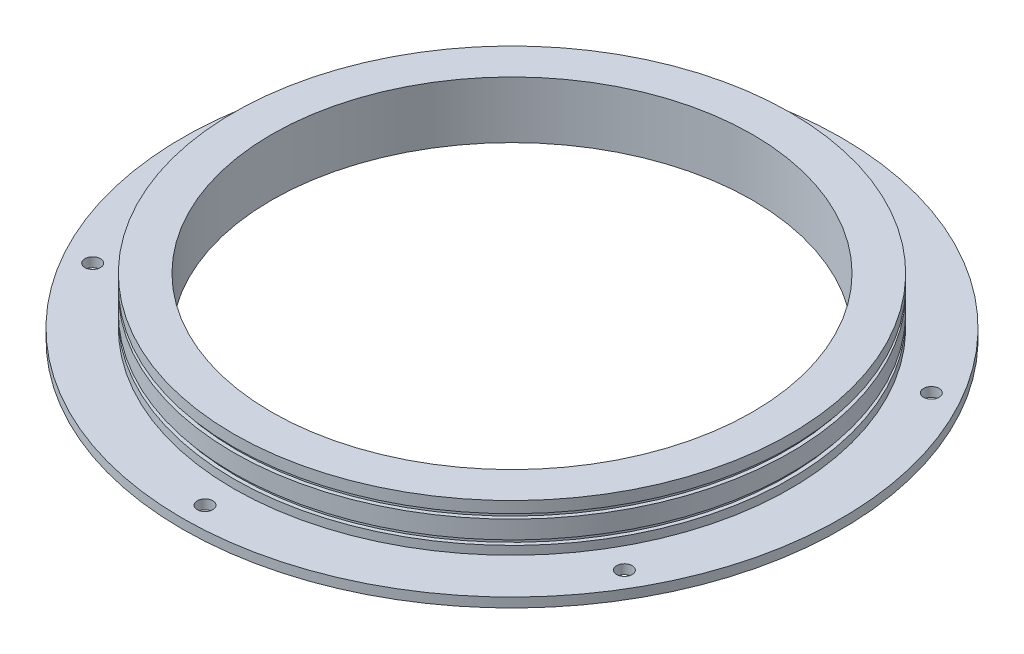
ISO-10303-21;
HEADER;
FILE_DESCRIPTION(('STEP AP214'),'2;1');
FILE_NAME('part.step','',(''),(''),'','','');
FILE_SCHEMA(('AUTOMOTIVE_DESIGN { 1 0 10303 214 1 1 1 1 }'));
ENDSEC;
DATA;
#1=APPLICATION_CONTEXT('core data for automotive mechanical design processes');
#2=APPLICATION_PROTOCOL_DEFINITION('international standard','automotive_design',2000,#1);
#3=PRODUCT_CONTEXT('',#1,'mechanical');
#4=PRODUCT('Part','Part','',(#3));
#5=PRODUCT_RELATED_PRODUCT_CATEGORY('part','',(#4));
#6=PRODUCT_DEFINITION_FORMATION('','',#4);
#7=PRODUCT_DEFINITION_CONTEXT('part definition',#1,'design');
#8=PRODUCT_DEFINITION('design','',#6,#7);
#9=PRODUCT_DEFINITION_SHAPE('','',#8);
#10=(LENGTH_UNIT() NAMED_UNIT(*) SI_UNIT(.MILLI.,.METRE.));
#11=(NAMED_UNIT(*) PLANE_ANGLE_UNIT() SI_UNIT($,.RADIAN.));
#12=(NAMED_UNIT(*) SI_UNIT($,.STERADIAN.) SOLID_ANGLE_UNIT());
#13=UNCERTAINTY_MEASURE_WITH_UNIT(LENGTH_MEASURE(1.E-05),#10,'distance_accuracy_value','');
#14=(GEOMETRIC_REPRESENTATION_CONTEXT(3) GLOBAL_UNCERTAINTY_ASSIGNED_CONTEXT((#13)) GLOBAL_UNIT_ASSIGNED_CONTEXT((#10,
#11,#12)) REPRESENTATION_CONTEXT('',''));
#15=CARTESIAN_POINT('',(0.,0.,0.));
#16=DIRECTION('',(0.,0.,1.));
#17=DIRECTION('',(1.,0.,0.));
#18=AXIS2_PLACEMENT_3D('',#15,#16,#17);
#19=CARTESIAN_POINT('',(0.,30.,0.));
#20=DIRECTION('',(0.,-1.,0.));
#21=DIRECTION('',(0.,0.,-1.));
#22=AXIS2_PLACEMENT_3D('',#19,#20,#21);
#23=CYLINDRICAL_SURFACE('',#22,146.85);
#24=CARTESIAN_POINT('',(0.,12.,0.));
#25=DIRECTION('',(0.,1.,0.));
#26=DIRECTION('',(0.,0.,1.));
#27=AXIS2_PLACEMENT_3D('',#24,#25,#26);
#28=CIRCLE('',#27,146.85);
#29=CARTESIAN_POINT('',(0.,12.,146.85));
#30=VERTEX_POINT('',#29);
#31=EDGE_CURVE('E157',#30,#30,#28,.T.);
#32=ORIENTED_EDGE('',*,*,#31,.T.);
#33=EDGE_LOOP('',(#32));
#34=FACE_BOUND('',#33,.T.);
#35=CARTESIAN_POINT('',(0.,21.5,0.));
#36=DIRECTION('',(0.,1.,0.));
#37=DIRECTION('',(0.,0.,1.));
#38=AXIS2_PLACEMENT_3D('',#35,#36,#37);
#39=CIRCLE('',#38,146.85);
#40=CARTESIAN_POINT('',(0.,21.5,146.85));
#41=VERTEX_POINT('',#40);
#42=EDGE_CURVE('E163',#41,#41,#39,.T.);
#43=ORIENTED_EDGE('',*,*,#42,.F.);
#44=EDGE_LOOP('',(#43));
#45=FACE_BOUND('',#44,.T.);
#46=ADVANCED_FACE('F37',(#34,#45),#23,.T.);
#47=CARTESIAN_POINT('',(0.,5.,0.));
#48=DIRECTION('',(0.,1.,0.));
#49=DIRECTION('',(0.,0.,1.));
#50=AXIS2_PLACEMENT_3D('',#47,#48,#49);
#51=CIRCLE('',#50,146.85);
#52=CARTESIAN_POINT('',(0.,5.,146.85));
#53=VERTEX_POINT('',#52);
#54=EDGE_CURVE('E58',#53,#53,#51,.F.);
#55=ORIENTED_EDGE('',*,*,#54,.F.);
#56=EDGE_LOOP('',(#55));
#57=FACE_BOUND('',#56,.T.);
#58=CARTESIAN_POINT('',(0.,9.5,0.));
#59=DIRECTION('',(0.,1.,0.));
#60=DIRECTION('',(0.,0.,1.));
#61=AXIS2_PLACEMENT_3D('',#58,#59,#60);
#62=CIRCLE('',#61,146.85);
#63=CARTESIAN_POINT('',(0.,9.5,146.85));
#64=VERTEX_POINT('',#63);
#65=EDGE_CURVE('E154',#64,#64,#62,.T.);
#66=ORIENTED_EDGE('',*,*,#65,.F.);
#67=EDGE_LOOP('',(#66));
#68=FACE_BOUND('',#67,.T.);
#69=ADVANCED_FACE('F113',(#57,#68),#23,.T.);
#70=CARTESIAN_POINT('',(0.,5.,-161.925));
#71=DIRECTION('',(0.,-1.,0.));
#72=DIRECTION('',(0.,0.,-1.));
#73=AXIS2_PLACEMENT_3D('',#70,#71,#72);
#74=CYLINDRICAL_SURFACE('',#73,4.09999999999999);
#75=CARTESIAN_POINT('',(0.,5.,-161.925));
#76=DIRECTION('',(0.,1.,0.));
#77=DIRECTION('',(0.,0.,1.));
#78=AXIS2_PLACEMENT_3D('',#75,#76,#77);
#79=CIRCLE('',#78,4.09999999999999);
#80=CARTESIAN_POINT('',(0.,5.,-157.825));
#81=VERTEX_POINT('',#80);
#82=EDGE_CURVE('E45',#81,#81,#79,.T.);
#83=ORIENTED_EDGE('',*,*,#82,.T.);
#84=EDGE_LOOP('',(#83));
#85=FACE_BOUND('',#84,.T.);
#86=CARTESIAN_POINT('',(0.,0.,-161.925));
#87=DIRECTION('',(0.,1.,0.));
#88=DIRECTION('',(0.,0.,1.));
#89=AXIS2_PLACEMENT_3D('',#86,#87,#88);
#90=CIRCLE('',#89,4.09999999999999);
#91=CARTESIAN_POINT('',(0.,0.,-157.825));
#92=VERTEX_POINT('',#91);
#93=EDGE_CURVE('E72',#92,#92,#90,.T.);
#94=ORIENTED_EDGE('',*,*,#93,.F.);
#95=EDGE_LOOP('',(#94));
#96=FACE_BOUND('',#95,.T.);
#97=ADVANCED_FACE('F110',(#85,#96),#74,.F.);
#98=CARTESIAN_POINT('',(140.231163507799,5.,-80.9625000000059));
#99=DIRECTION('',(0.,-1.,0.));
#100=DIRECTION('',(0.,0.,-1.));
#101=AXIS2_PLACEMENT_3D('',#98,#99,#100);
#102=CYLINDRICAL_SURFACE('',#101,4.09999999999998);
#103=CARTESIAN_POINT('',(140.231163507799,5.,-80.9625000000059));
#104=DIRECTION('',(0.,1.,0.));
#105=DIRECTION('',(0.,0.,1.));
#106=AXIS2_PLACEMENT_3D('',#103,#104,#105);
#107=CIRCLE('',#106,4.09999999999998);
#108=CARTESIAN_POINT('',(140.231163507799,5.,-76.862500000006));
#109=VERTEX_POINT('',#108);
#110=EDGE_CURVE('E50',#109,#109,#107,.T.);
#111=ORIENTED_EDGE('',*,*,#110,.T.);
#112=EDGE_LOOP('',(#111));
#113=FACE_BOUND('',#112,.T.);
#114=CARTESIAN_POINT('',(140.231163507799,0.,-80.9625000000059));
#115=DIRECTION('',(0.,1.,0.));
#116=DIRECTION('',(0.,0.,1.));
#117=AXIS2_PLACEMENT_3D('',#114,#115,#116);
#118=CIRCLE('',#117,4.09999999999998);
#119=CARTESIAN_POINT('',(140.231163507799,0.,-76.862500000006));
#120=VERTEX_POINT('',#119);
#121=EDGE_CURVE('E70',#120,#120,#118,.T.);
#122=ORIENTED_EDGE('',*,*,#121,.F.);
#123=EDGE_LOOP('',(#122));
#124=FACE_BOUND('',#123,.T.);
#125=ADVANCED_FACE('F98',(#113,#124),#102,.F.);
#126=CARTESIAN_POINT('',(140.231163507805,5.,80.9624999999941));
#127=DIRECTION('',(0.,-1.,0.));
#128=DIRECTION('',(0.,0.,-1.));
#129=AXIS2_PLACEMENT_3D('',#126,#127,#128);
#130=CYLINDRICAL_SURFACE('',#129,4.09999999999998);
#131=CARTESIAN_POINT('',(140.231163507805,5.,80.9624999999941));
#132=DIRECTION('',(0.,1.,0.));
#133=DIRECTION('',(0.,0.,1.));
#134=AXIS2_PLACEMENT_3D('',#131,#132,#133);
#135=CIRCLE('',#134,4.09999999999998);
#136=CARTESIAN_POINT('',(140.231163507805,5.,85.0624999999941));
#137=VERTEX_POINT('',#136);
#138=EDGE_CURVE('E93',#137,#137,#135,.T.);
#139=ORIENTED_EDGE('',*,*,#138,.T.);
#140=EDGE_LOOP('',(#139));
#141=FACE_BOUND('',#140,.T.);
#142=CARTESIAN_POINT('',(140.231163507805,0.,80.9624999999941));
#143=DIRECTION('',(0.,1.,0.));
#144=DIRECTION('',(0.,0.,1.));
#145=AXIS2_PLACEMENT_3D('',#142,#143,#144);
#146=CIRCLE('',#145,4.09999999999998);
#147=CARTESIAN_POINT('',(140.231163507805,0.,85.0624999999941));
#148=VERTEX_POINT('',#147);
#149=EDGE_CURVE('E67',#148,#148,#146,.T.);
#150=ORIENTED_EDGE('',*,*,#149,.F.);
#151=EDGE_LOOP('',(#150));
#152=FACE_BOUND('',#151,.T.);
#153=ADVANCED_FACE('F119',(#141,#152),#130,.F.);
#154=CARTESIAN_POINT('',(1.36158713980121E-11,5.,161.925));
#155=DIRECTION('',(0.,-1.,0.));
#156=DIRECTION('',(0.,0.,-1.));
#157=AXIS2_PLACEMENT_3D('',#154,#155,#156);
#158=CYLINDRICAL_SURFACE('',#157,4.09999999999999);
#159=CARTESIAN_POINT('',(1.36158713980121E-11,5.,161.925));
#160=DIRECTION('',(0.,1.,0.));
#161=DIRECTION('',(0.,0.,1.));
#162=AXIS2_PLACEMENT_3D('',#159,#160,#161);
#163=CIRCLE('',#162,4.09999999999999);
#164=CARTESIAN_POINT('',(1.36158713980121E-11,5.,166.025));
#165=VERTEX_POINT('',#164);
#166=EDGE_CURVE('E86',#165,#165,#163,.T.);
#167=ORIENTED_EDGE('',*,*,#166,.T.);
#168=EDGE_LOOP('',(#167));
#169=FACE_BOUND('',#168,.T.);
#170=CARTESIAN_POINT('',(1.36158713980121E-11,0.,161.925));
#171=DIRECTION('',(0.,1.,0.));
#172=DIRECTION('',(0.,0.,1.));
#173=AXIS2_PLACEMENT_3D('',#170,#171,#172);
#174=CIRCLE('',#173,4.09999999999999);
#175=CARTESIAN_POINT('',(1.36158713980121E-11,0.,166.025));
#176=VERTEX_POINT('',#175);
#177=EDGE_CURVE('E64',#176,#176,#174,.T.);
#178=ORIENTED_EDGE('',*,*,#177,.F.);
#179=EDGE_LOOP('',(#178));
#180=FACE_BOUND('',#179,.T.);
#181=ADVANCED_FACE('F326',(#169,#180),#158,.F.);
#182=CARTESIAN_POINT('',(-140.231163507785,5.,80.9625000000059));
#183=DIRECTION('',(0.,-1.,0.));
#184=DIRECTION('',(0.,0.,-1.));
#185=AXIS2_PLACEMENT_3D('',#182,#183,#184);
#186=CYLINDRICAL_SURFACE('',#185,4.09999999999998);
#187=CARTESIAN_POINT('',(-140.231163507785,5.,80.9625000000059));
#188=DIRECTION('',(0.,1.,0.));
#189=DIRECTION('',(0.,0.,1.));
#190=AXIS2_PLACEMENT_3D('',#187,#188,#189);
#191=CIRCLE('',#190,4.09999999999998);
#192=CARTESIAN_POINT('',(-140.231163507785,5.,85.0625000000059));
#193=VERTEX_POINT('',#192);
#194=EDGE_CURVE('E81',#193,#193,#191,.T.);
#195=ORIENTED_EDGE('',*,*,#194,.T.);
#196=EDGE_LOOP('',(#195));
#197=FACE_BOUND('',#196,.T.);
#198=CARTESIAN_POINT('',(-140.231163507785,0.,80.9625000000059));
#199=DIRECTION('',(0.,1.,0.));
#200=DIRECTION('',(0.,0.,1.));
#201=AXIS2_PLACEMENT_3D('',#198,#199,#200);
#202=CIRCLE('',#201,4.09999999999998);
#203=CARTESIAN_POINT('',(-140.231163507785,0.,85.0625000000059));
#204=VERTEX_POINT('',#203);
#205=EDGE_CURVE('E61',#204,#204,#202,.T.);
#206=ORIENTED_EDGE('',*,*,#205,.F.);
#207=EDGE_LOOP('',(#206));
#208=FACE_BOUND('',#207,.T.);
#209=ADVANCED_FACE('F318',(#197,#208),#186,.F.);
#210=CARTESIAN_POINT('',(-140.231163507792,5.,-80.962499999994));
#211=DIRECTION('',(0.,-1.,0.));
#212=DIRECTION('',(0.,0.,-1.));
#213=AXIS2_PLACEMENT_3D('',#210,#211,#212);
#214=CYLINDRICAL_SURFACE('',#213,4.09999999999998);
#215=CARTESIAN_POINT('',(-140.231163507792,5.,-80.962499999994));
#216=DIRECTION('',(0.,1.,0.));
#217=DIRECTION('',(0.,0.,1.));
#218=AXIS2_PLACEMENT_3D('',#215,#216,#217);
#219=CIRCLE('',#218,4.09999999999998);
#220=CARTESIAN_POINT('',(-140.231163507792,5.,-76.862499999994));
#221=VERTEX_POINT('',#220);
#222=EDGE_CURVE('E77',#221,#221,#219,.T.);
#223=ORIENTED_EDGE('',*,*,#222,.T.);
#224=EDGE_LOOP('',(#223));
#225=FACE_BOUND('',#224,.T.);
#226=CARTESIAN_POINT('',(-140.231163507792,0.,-80.962499999994));
#227=DIRECTION('',(0.,1.,0.));
#228=DIRECTION('',(0.,0.,1.));
#229=AXIS2_PLACEMENT_3D('',#226,#227,#228);
#230=CIRCLE('',#229,4.09999999999998);
#231=CARTESIAN_POINT('',(-140.231163507792,0.,-76.862499999994));
#232=VERTEX_POINT('',#231);
#233=EDGE_CURVE('E57',#232,#232,#230,.T.);
#234=ORIENTED_EDGE('',*,*,#233,.F.);
#235=EDGE_LOOP('',(#234));
#236=FACE_BOUND('',#235,.T.);
#237=ADVANCED_FACE('F310',(#225,#236),#214,.F.);
#238=CARTESIAN_POINT('',(0.,5.,0.));
#239=DIRECTION('',(0.,-1.,0.));
#240=DIRECTION('',(0.,0.,-1.));
#241=AXIS2_PLACEMENT_3D('',#238,#239,#240);
#242=CYLINDRICAL_SURFACE('',#241,126.85);
#243=CARTESIAN_POINT('',(0.,0.,0.));
#244=DIRECTION('',(0.,1.,0.));
#245=DIRECTION('',(0.,0.,1.));
#246=AXIS2_PLACEMENT_3D('',#243,#244,#245);
#247=CIRCLE('',#246,126.85);
#248=CARTESIAN_POINT('',(0.,0.,126.85));
#249=VERTEX_POINT('',#248);
#250=EDGE_CURVE('E54',#249,#249,#247,.T.);
#251=ORIENTED_EDGE('',*,*,#250,.F.);
#252=EDGE_LOOP('',(#251));
#253=FACE_BOUND('',#252,.T.);
#254=CARTESIAN_POINT('',(0.,30.,0.));
#255=DIRECTION('',(0.,1.,0.));
#256=DIRECTION('',(0.,0.,1.));
#257=AXIS2_PLACEMENT_3D('',#254,#255,#256);
#258=CIRCLE('',#257,126.85);
#259=CARTESIAN_POINT('',(0.,30.,126.85));
#260=VERTEX_POINT('',#259);
#261=EDGE_CURVE('E151',#260,#260,#258,.T.);
#262=ORIENTED_EDGE('',*,*,#261,.T.);
#263=EDGE_LOOP('',(#262));
#264=FACE_BOUND('',#263,.T.);
#265=ADVANCED_FACE('F39',(#253,#264),#242,.F.);
#266=CARTESIAN_POINT('',(0.,5.,0.));
#267=DIRECTION('',(0.,-1.,0.));
#268=DIRECTION('',(0.,0.,-1.));
#269=AXIS2_PLACEMENT_3D('',#266,#267,#268);
#270=CYLINDRICAL_SURFACE('',#269,173.85);
#271=CARTESIAN_POINT('',(0.,5.,0.));
#272=DIRECTION('',(0.,1.,0.));
#273=DIRECTION('',(0.,0.,1.));
#274=AXIS2_PLACEMENT_3D('',#271,#272,#273);
#275=CIRCLE('',#274,173.85);
#276=CARTESIAN_POINT('',(0.,5.,173.85));
#277=VERTEX_POINT('',#276);
#278=EDGE_CURVE('E10',#277,#277,#275,.T.);
#279=ORIENTED_EDGE('',*,*,#278,.F.);
#280=EDGE_LOOP('',(#279));
#281=FACE_BOUND('',#280,.T.);
#282=CARTESIAN_POINT('',(0.,0.,0.));
#283=DIRECTION('',(0.,1.,0.));
#284=DIRECTION('',(0.,0.,1.));
#285=AXIS2_PLACEMENT_3D('',#282,#283,#284);
#286=CIRCLE('',#285,173.85);
#287=CARTESIAN_POINT('',(0.,0.,173.85));
#288=VERTEX_POINT('',#287);
#289=EDGE_CURVE('E41',#288,#288,#286,.T.);
#290=ORIENTED_EDGE('',*,*,#289,.T.);
#291=EDGE_LOOP('',(#290));
#292=FACE_BOUND('',#291,.T.);
#293=ADVANCED_FACE('F105',(#281,#292),#270,.T.);
#294=CARTESIAN_POINT('',(0.,5.,0.));
#295=DIRECTION('',(0.,1.,0.));
#296=DIRECTION('',(0.,0.,1.));
#297=AXIS2_PLACEMENT_3D('',#294,#295,#296);
#298=PLANE('',#297);
#299=ORIENTED_EDGE('',*,*,#54,.T.);
#300=EDGE_LOOP('',(#299));
#301=FACE_BOUND('',#300,.T.);
#302=ORIENTED_EDGE('',*,*,#222,.F.);
#303=EDGE_LOOP('',(#302));
#304=FACE_BOUND('',#303,.T.);
#305=ORIENTED_EDGE('',*,*,#194,.F.);
#306=EDGE_LOOP('',(#305));
#307=FACE_BOUND('',#306,.T.);
#308=ORIENTED_EDGE('',*,*,#166,.F.);
#309=EDGE_LOOP('',(#308));
#310=FACE_BOUND('',#309,.T.);
#311=ORIENTED_EDGE('',*,*,#138,.F.);
#312=EDGE_LOOP('',(#311));
#313=FACE_BOUND('',#312,.T.);
#314=ORIENTED_EDGE('',*,*,#110,.F.);
#315=EDGE_LOOP('',(#314));
#316=FACE_BOUND('',#315,.T.);
#317=ORIENTED_EDGE('',*,*,#82,.F.);
#318=EDGE_LOOP('',(#317));
#319=FACE_BOUND('',#318,.T.);
#320=ORIENTED_EDGE('',*,*,#278,.T.);
#321=EDGE_LOOP('',(#320));
#322=FACE_BOUND('',#321,.T.);
#323=ADVANCED_FACE('F101',(#301,#304,#307,#310,#313,#316,#319,#322),#298,.T.);
#324=CARTESIAN_POINT('',(0.,0.,0.));
#325=DIRECTION('',(0.,1.,0.));
#326=DIRECTION('',(0.,0.,1.));
#327=AXIS2_PLACEMENT_3D('',#324,#325,#326);
#328=PLANE('',#327);
#329=ORIENTED_EDGE('',*,*,#233,.T.);
#330=EDGE_LOOP('',(#329));
#331=FACE_BOUND('',#330,.T.);
#332=ORIENTED_EDGE('',*,*,#205,.T.);
#333=EDGE_LOOP('',(#332));
#334=FACE_BOUND('',#333,.T.);
#335=ORIENTED_EDGE('',*,*,#177,.T.);
#336=EDGE_LOOP('',(#335));
#337=FACE_BOUND('',#336,.T.);
#338=ORIENTED_EDGE('',*,*,#149,.T.);
#339=EDGE_LOOP('',(#338));
#340=FACE_BOUND('',#339,.T.);
#341=ORIENTED_EDGE('',*,*,#121,.T.);
#342=EDGE_LOOP('',(#341));
#343=FACE_BOUND('',#342,.T.);
#344=ORIENTED_EDGE('',*,*,#93,.T.);
#345=EDGE_LOOP('',(#344));
#346=FACE_BOUND('',#345,.T.);
#347=ORIENTED_EDGE('',*,*,#289,.F.);
#348=EDGE_LOOP('',(#347));
#349=FACE_BOUND('',#348,.T.);
#350=ORIENTED_EDGE('',*,*,#250,.T.);
#351=EDGE_LOOP('',(#350));
#352=FACE_BOUND('',#351,.T.);
#353=ADVANCED_FACE('F104',(#331,#334,#337,#340,#343,#346,#349,#352),#328,.F.);
#354=CARTESIAN_POINT('',(0.,24.,0.));
#355=DIRECTION('',(0.,1.,0.));
#356=DIRECTION('',(0.,0.,1.));
#357=AXIS2_PLACEMENT_3D('',#354,#355,#356);
#358=CIRCLE('',#357,146.85);
#359=CARTESIAN_POINT('',(0.,24.,146.85));
#360=VERTEX_POINT('',#359);
#361=EDGE_CURVE('E146',#360,#360,#358,.T.);
#362=ORIENTED_EDGE('',*,*,#361,.T.);
#363=EDGE_LOOP('',(#362));
#364=FACE_BOUND('',#363,.T.);
#365=CARTESIAN_POINT('',(0.,30.,0.));
#366=DIRECTION('',(0.,1.,0.));
#367=DIRECTION('',(0.,0.,1.));
#368=AXIS2_PLACEMENT_3D('',#365,#366,#367);
#369=CIRCLE('',#368,146.85);
#370=CARTESIAN_POINT('',(0.,30.,146.85));
#371=VERTEX_POINT('',#370);
#372=EDGE_CURVE('E149',#371,#371,#369,.T.);
#373=ORIENTED_EDGE('',*,*,#372,.F.);
#374=EDGE_LOOP('',(#373));
#375=FACE_BOUND('',#374,.T.);
#376=ADVANCED_FACE('F123',(#364,#375),#23,.T.);
#377=CARTESIAN_POINT('',(0.,30.,0.));
#378=DIRECTION('',(0.,1.,0.));
#379=DIRECTION('',(0.,0.,1.));
#380=AXIS2_PLACEMENT_3D('',#377,#378,#379);
#381=PLANE('',#380);
#382=ORIENTED_EDGE('',*,*,#261,.F.);
#383=EDGE_LOOP('',(#382));
#384=FACE_BOUND('',#383,.T.);
#385=ORIENTED_EDGE('',*,*,#372,.T.);
#386=EDGE_LOOP('',(#385));
#387=FACE_BOUND('',#386,.T.);
#388=ADVANCED_FACE('F133',(#384,#387),#381,.T.);
#389=CARTESIAN_POINT('',(0.,9.5,0.));
#390=DIRECTION('',(0.,1.,0.));
#391=DIRECTION('',(0.,0.,1.));
#392=AXIS2_PLACEMENT_3D('',#389,#390,#391);
#393=CYLINDRICAL_SURFACE('',#392,144.85);
#394=CARTESIAN_POINT('',(0.,9.5,0.));
#395=DIRECTION('',(0.,1.,0.));
#396=DIRECTION('',(0.,0.,1.));
#397=AXIS2_PLACEMENT_3D('',#394,#395,#396);
#398=CIRCLE('',#397,144.85);
#399=CARTESIAN_POINT('',(0.,9.5,144.85));
#400=VERTEX_POINT('',#399);
#401=EDGE_CURVE('E159',#400,#400,#398,.T.);
#402=ORIENTED_EDGE('',*,*,#401,.T.);
#403=EDGE_LOOP('',(#402));
#404=FACE_BOUND('',#403,.T.);
#405=CARTESIAN_POINT('',(0.,12.,0.));
#406=DIRECTION('',(0.,1.,0.));
#407=DIRECTION('',(0.,0.,1.));
#408=AXIS2_PLACEMENT_3D('',#405,#406,#407);
#409=CIRCLE('',#408,144.85);
#410=CARTESIAN_POINT('',(0.,12.,144.85));
#411=VERTEX_POINT('',#410);
#412=EDGE_CURVE('E160',#411,#411,#409,.T.);
#413=ORIENTED_EDGE('',*,*,#412,.F.);
#414=EDGE_LOOP('',(#413));
#415=FACE_BOUND('',#414,.T.);
#416=ADVANCED_FACE('F139',(#404,#415),#393,.T.);
#417=CARTESIAN_POINT('',(0.,9.5,0.));
#418=DIRECTION('',(0.,1.,0.));
#419=DIRECTION('',(0.,0.,1.));
#420=AXIS2_PLACEMENT_3D('',#417,#418,#419);
#421=PLANE('',#420);
#422=ORIENTED_EDGE('',*,*,#401,.F.);
#423=EDGE_LOOP('',(#422));
#424=FACE_BOUND('',#423,.T.);
#425=ORIENTED_EDGE('',*,*,#65,.T.);
#426=EDGE_LOOP('',(#425));
#427=FACE_BOUND('',#426,.T.);
#428=ADVANCED_FACE('F196',(#424,#427),#421,.T.);
#429=CARTESIAN_POINT('',(0.,12.,0.));
#430=DIRECTION('',(0.,1.,0.));
#431=DIRECTION('',(0.,0.,1.));
#432=AXIS2_PLACEMENT_3D('',#429,#430,#431);
#433=PLANE('',#432);
#434=ORIENTED_EDGE('',*,*,#412,.T.);
#435=EDGE_LOOP('',(#434));
#436=FACE_BOUND('',#435,.T.);
#437=ORIENTED_EDGE('',*,*,#31,.F.);
#438=EDGE_LOOP('',(#437));
#439=FACE_BOUND('',#438,.T.);
#440=ADVANCED_FACE('F193',(#436,#439),#433,.F.);
#441=CARTESIAN_POINT('',(0.,21.5,0.));
#442=DIRECTION('',(0.,1.,0.));
#443=DIRECTION('',(0.,0.,1.));
#444=AXIS2_PLACEMENT_3D('',#441,#442,#443);
#445=CYLINDRICAL_SURFACE('',#444,144.85);
#446=CARTESIAN_POINT('',(0.,21.5,0.));
#447=DIRECTION('',(0.,1.,0.));
#448=DIRECTION('',(0.,0.,1.));
#449=AXIS2_PLACEMENT_3D('',#446,#447,#448);
#450=CIRCLE('',#449,144.85);
#451=CARTESIAN_POINT('',(0.,21.5,144.85));
#452=VERTEX_POINT('',#451);
#453=EDGE_CURVE('E169',#452,#452,#450,.T.);
#454=ORIENTED_EDGE('',*,*,#453,.T.);
#455=EDGE_LOOP('',(#454));
#456=FACE_BOUND('',#455,.T.);
#457=CARTESIAN_POINT('',(0.,24.,0.));
#458=DIRECTION('',(0.,1.,0.));
#459=DIRECTION('',(0.,0.,1.));
#460=AXIS2_PLACEMENT_3D('',#457,#458,#459);
#461=CIRCLE('',#460,144.85);
#462=CARTESIAN_POINT('',(0.,24.,144.85));
#463=VERTEX_POINT('',#462);
#464=EDGE_CURVE('E170',#463,#463,#461,.T.);
#465=ORIENTED_EDGE('',*,*,#464,.F.);
#466=EDGE_LOOP('',(#465));
#467=FACE_BOUND('',#466,.T.);
#468=ADVANCED_FACE('F178',(#456,#467),#445,.T.);
#469=CARTESIAN_POINT('',(0.,21.5,0.));
#470=DIRECTION('',(0.,1.,0.));
#471=DIRECTION('',(0.,0.,1.));
#472=AXIS2_PLACEMENT_3D('',#469,#470,#471);
#473=PLANE('',#472);
#474=ORIENTED_EDGE('',*,*,#453,.F.);
#475=EDGE_LOOP('',(#474));
#476=FACE_BOUND('',#475,.T.);
#477=ORIENTED_EDGE('',*,*,#42,.T.);
#478=EDGE_LOOP('',(#477));
#479=FACE_BOUND('',#478,.T.);
#480=ADVANCED_FACE('F181',(#476,#479),#473,.T.);
#481=CARTESIAN_POINT('',(0.,24.,0.));
#482=DIRECTION('',(0.,1.,0.));
#483=DIRECTION('',(0.,0.,1.));
#484=AXIS2_PLACEMENT_3D('',#481,#482,#483);
#485=PLANE('',#484);
#486=ORIENTED_EDGE('',*,*,#464,.T.);
#487=EDGE_LOOP('',(#486));
#488=FACE_BOUND('',#487,.T.);
#489=ORIENTED_EDGE('',*,*,#361,.F.);
#490=EDGE_LOOP('',(#489));
#491=FACE_BOUND('',#490,.T.);
#492=ADVANCED_FACE('F184',(#488,#491),#485,.F.);
#493=CLOSED_SHELL('',(#46,#69,#97,#125,#153,#181,#209,#237,#265,#293,#323,#353,#376,#388,#416,
#428,#440,#468,#480,#492));
#494=MANIFOLD_SOLID_BREP('B2',#493);
#495=ADVANCED_BREP_SHAPE_REPRESENTATION('',(#18,#494),#14);
#496=SHAPE_DEFINITION_REPRESENTATION(#9,#495);
ENDSEC;
END-ISO-10303-21;
